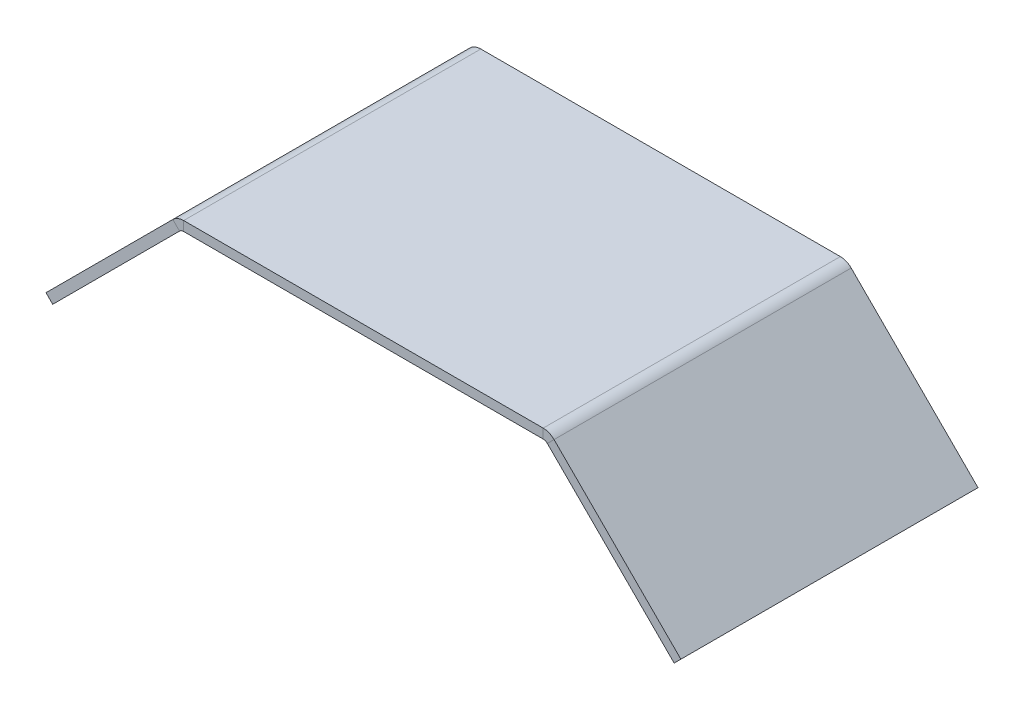
ISO-10303-21;
HEADER;
FILE_DESCRIPTION(('STEP AP214'),'2;1');
FILE_NAME('part.step','',(''),(''),'','','');
FILE_SCHEMA(('AUTOMOTIVE_DESIGN { 1 0 10303 214 1 1 1 1 }'));
ENDSEC;
DATA;
#1=APPLICATION_CONTEXT('core data for automotive mechanical design processes');
#2=APPLICATION_PROTOCOL_DEFINITION('international standard','automotive_design',2000,#1);
#3=PRODUCT_CONTEXT('',#1,'mechanical');
#4=PRODUCT('Part','Part','',(#3));
#5=PRODUCT_RELATED_PRODUCT_CATEGORY('part','',(#4));
#6=PRODUCT_DEFINITION_FORMATION('','',#4);
#7=PRODUCT_DEFINITION_CONTEXT('part definition',#1,'design');
#8=PRODUCT_DEFINITION('design','',#6,#7);
#9=PRODUCT_DEFINITION_SHAPE('','',#8);
#10=(LENGTH_UNIT() NAMED_UNIT(*) SI_UNIT(.MILLI.,.METRE.));
#11=(NAMED_UNIT(*) PLANE_ANGLE_UNIT() SI_UNIT($,.RADIAN.));
#12=(NAMED_UNIT(*) SI_UNIT($,.STERADIAN.) SOLID_ANGLE_UNIT());
#13=UNCERTAINTY_MEASURE_WITH_UNIT(LENGTH_MEASURE(1.E-05),#10,'distance_accuracy_value','');
#14=(GEOMETRIC_REPRESENTATION_CONTEXT(3) GLOBAL_UNCERTAINTY_ASSIGNED_CONTEXT((#13)) GLOBAL_UNIT_ASSIGNED_CONTEXT((#10,
#11,#12)) REPRESENTATION_CONTEXT('',''));
#15=CARTESIAN_POINT('',(0.,0.,0.));
#16=DIRECTION('',(0.,0.,1.));
#17=DIRECTION('',(1.,0.,0.));
#18=AXIS2_PLACEMENT_3D('',#15,#16,#17);
#19=CARTESIAN_POINT('',(-30.734,-1.6256,25.4));
#20=DIRECTION('',(0.,0.,1.));
#21=DIRECTION('',(1.,0.,0.));
#22=AXIS2_PLACEMENT_3D('',#19,#20,#21);
#23=PLANE('',#22);
#24=DIRECTION('',(1.,0.,0.));
#25=VECTOR('',#24,1.);
#26=CARTESIAN_POINT('',(-30.734,0.,25.4));
#27=LINE('',#26,#25);
#28=CARTESIAN_POINT('',(-30.734,0.,25.4));
#29=VERTEX_POINT('',#28);
#30=CARTESIAN_POINT('',(30.734,0.,25.4));
#31=VERTEX_POINT('',#30);
#32=EDGE_CURVE('E267',#29,#31,#27,.T.);
#33=ORIENTED_EDGE('',*,*,#32,.F.);
#34=DIRECTION('',(0.,1.,0.));
#35=VECTOR('',#34,1.);
#36=CARTESIAN_POINT('',(-30.734,-1.6256,25.4));
#37=LINE('',#36,#35);
#38=CARTESIAN_POINT('',(-30.734,-1.6256,25.4));
#39=VERTEX_POINT('',#38);
#40=EDGE_CURVE('E90',#39,#29,#37,.T.);
#41=ORIENTED_EDGE('',*,*,#40,.F.);
#42=DIRECTION('',(1.,0.,0.));
#43=VECTOR('',#42,1.);
#44=CARTESIAN_POINT('',(-30.734,-1.6256,25.4));
#45=LINE('',#44,#43);
#46=CARTESIAN_POINT('',(30.734,-1.6256,25.4));
#47=VERTEX_POINT('',#46);
#48=EDGE_CURVE('E272',#39,#47,#45,.T.);
#49=ORIENTED_EDGE('',*,*,#48,.T.);
#50=DIRECTION('',(0.,1.,0.));
#51=VECTOR('',#50,1.);
#52=CARTESIAN_POINT('',(30.734,-1.6256,25.4));
#53=LINE('',#52,#51);
#54=EDGE_CURVE('E13',#47,#31,#53,.T.);
#55=ORIENTED_EDGE('',*,*,#54,.T.);
#56=EDGE_LOOP('',(#33,#41,#49,#55));
#57=FACE_BOUND('',#56,.T.);
#58=ADVANCED_FACE('F81',(#57),#23,.T.);
#59=CARTESIAN_POINT('',(-30.734,-1.6256,-25.4));
#60=DIRECTION('',(0.,0.,-1.));
#61=DIRECTION('',(-1.,0.,0.));
#62=AXIS2_PLACEMENT_3D('',#59,#60,#61);
#63=PLANE('',#62);
#64=DIRECTION('',(-1.,0.,0.));
#65=VECTOR('',#64,1.);
#66=CARTESIAN_POINT('',(-30.734,0.,-25.4));
#67=LINE('',#66,#65);
#68=CARTESIAN_POINT('',(30.734,0.,-25.4));
#69=VERTEX_POINT('',#68);
#70=CARTESIAN_POINT('',(-30.734,0.,-25.4));
#71=VERTEX_POINT('',#70);
#72=EDGE_CURVE('E276',#69,#71,#67,.T.);
#73=ORIENTED_EDGE('',*,*,#72,.F.);
#74=DIRECTION('',(0.,1.,0.));
#75=VECTOR('',#74,1.);
#76=CARTESIAN_POINT('',(30.734,-1.6256,-25.4));
#77=LINE('',#76,#75);
#78=CARTESIAN_POINT('',(30.734,-1.6256,-25.4));
#79=VERTEX_POINT('',#78);
#80=EDGE_CURVE('E85',#79,#69,#77,.T.);
#81=ORIENTED_EDGE('',*,*,#80,.F.);
#82=DIRECTION('',(-1.,0.,0.));
#83=VECTOR('',#82,1.);
#84=CARTESIAN_POINT('',(-30.734,-1.6256,-25.4));
#85=LINE('',#84,#83);
#86=CARTESIAN_POINT('',(-30.734,-1.6256,-25.4));
#87=VERTEX_POINT('',#86);
#88=EDGE_CURVE('E266',#79,#87,#85,.T.);
#89=ORIENTED_EDGE('',*,*,#88,.T.);
#90=DIRECTION('',(0.,1.,0.));
#91=VECTOR('',#90,1.);
#92=CARTESIAN_POINT('',(-30.734,-1.6256,-25.4));
#93=LINE('',#92,#91);
#94=EDGE_CURVE('E284',#87,#71,#93,.T.);
#95=ORIENTED_EDGE('',*,*,#94,.T.);
#96=EDGE_LOOP('',(#73,#81,#89,#95));
#97=FACE_BOUND('',#96,.T.);
#98=ADVANCED_FACE('F83',(#97),#63,.T.);
#99=CARTESIAN_POINT('',(0.,-1.6256,0.));
#100=DIRECTION('',(0.,-1.,0.));
#101=DIRECTION('',(0.,0.,-1.));
#102=AXIS2_PLACEMENT_3D('',#99,#100,#101);
#103=PLANE('',#102);
#104=DIRECTION('',(0.,0.,-1.));
#105=VECTOR('',#104,1.);
#106=CARTESIAN_POINT('',(30.734,-1.6256,25.4));
#107=LINE('',#106,#105);
#108=EDGE_CURVE('E264',#47,#79,#107,.T.);
#109=ORIENTED_EDGE('',*,*,#108,.F.);
#110=ORIENTED_EDGE('',*,*,#48,.F.);
#111=DIRECTION('',(0.,0.,1.));
#112=VECTOR('',#111,1.);
#113=CARTESIAN_POINT('',(-30.734,-1.6256,25.4));
#114=LINE('',#113,#112);
#115=EDGE_CURVE('E270',#87,#39,#114,.T.);
#116=ORIENTED_EDGE('',*,*,#115,.F.);
#117=ORIENTED_EDGE('',*,*,#88,.F.);
#118=EDGE_LOOP('',(#109,#110,#116,#117));
#119=FACE_BOUND('',#118,.T.);
#120=ADVANCED_FACE('F304',(#119),#103,.T.);
#121=CARTESIAN_POINT('',(0.,0.,0.));
#122=DIRECTION('',(0.,-1.,0.));
#123=DIRECTION('',(0.,0.,-1.));
#124=AXIS2_PLACEMENT_3D('',#121,#122,#123);
#125=PLANE('',#124);
#126=DIRECTION('',(0.,0.,-1.));
#127=VECTOR('',#126,1.);
#128=CARTESIAN_POINT('',(30.734,0.,25.4));
#129=LINE('',#128,#127);
#130=EDGE_CURVE('E176',#31,#69,#129,.T.);
#131=ORIENTED_EDGE('',*,*,#130,.T.);
#132=ORIENTED_EDGE('',*,*,#72,.T.);
#133=DIRECTION('',(0.,0.,1.));
#134=VECTOR('',#133,1.);
#135=CARTESIAN_POINT('',(-30.734,0.,25.4));
#136=LINE('',#135,#134);
#137=EDGE_CURVE('E279',#71,#29,#136,.T.);
#138=ORIENTED_EDGE('',*,*,#137,.T.);
#139=ORIENTED_EDGE('',*,*,#32,.T.);
#140=EDGE_LOOP('',(#131,#132,#138,#139));
#141=FACE_BOUND('',#140,.T.);
#142=ADVANCED_FACE('F294',(#141),#125,.F.);
#143=CARTESIAN_POINT('',(-30.734,-2.6256,25.4));
#144=DIRECTION('',(0.,0.,1.));
#145=DIRECTION('',(1.,0.,0.));
#146=AXIS2_PLACEMENT_3D('',#143,#144,#145);
#147=PLANE('',#146);
#148=DIRECTION('',(0.707106781186544,-0.707106781186551,0.));
#149=VECTOR('',#148,1.);
#150=CARTESIAN_POINT('',(-32.5905795646834,-0.769020435316594,25.4));
#151=LINE('',#150,#149);
#152=CARTESIAN_POINT('',(-31.4411067811865,-1.91849321881345,25.4));
#153=VERTEX_POINT('',#152);
#154=CARTESIAN_POINT('',(-32.5905795646834,-0.769020435316591,25.4));
#155=VERTEX_POINT('',#154);
#156=EDGE_CURVE('E219',#153,#155,#151,.F.);
#157=ORIENTED_EDGE('',*,*,#156,.F.);
#158=CARTESIAN_POINT('',(-30.734,-2.6256,25.4));
#159=DIRECTION('',(0.,0.,-1.));
#160=DIRECTION('',(-1.,0.,0.));
#161=AXIS2_PLACEMENT_3D('',#158,#159,#160);
#162=CIRCLE('',#161,1.);
#163=EDGE_CURVE('E259',#39,#153,#162,.F.);
#164=ORIENTED_EDGE('',*,*,#163,.F.);
#165=ORIENTED_EDGE('',*,*,#40,.T.);
#166=CARTESIAN_POINT('',(-30.734,-2.6256,25.4));
#167=DIRECTION('',(0.,0.,-1.));
#168=DIRECTION('',(-1.,0.,0.));
#169=AXIS2_PLACEMENT_3D('',#166,#167,#168);
#170=CIRCLE('',#169,2.6256);
#171=EDGE_CURVE('E98',#29,#155,#170,.F.);
#172=ORIENTED_EDGE('',*,*,#171,.T.);
#173=EDGE_LOOP('',(#157,#164,#165,#172));
#174=FACE_BOUND('',#173,.T.);
#175=ADVANCED_FACE('F312',(#174),#147,.T.);
#176=CARTESIAN_POINT('',(-30.734,-2.6256,-25.4));
#177=DIRECTION('',(0.,0.,1.));
#178=DIRECTION('',(1.,0.,0.));
#179=AXIS2_PLACEMENT_3D('',#176,#177,#178);
#180=PLANE('',#179);
#181=CARTESIAN_POINT('',(-30.734,-2.6256,-25.4));
#182=DIRECTION('',(0.,0.,-1.));
#183=DIRECTION('',(-1.,0.,0.));
#184=AXIS2_PLACEMENT_3D('',#181,#182,#183);
#185=CIRCLE('',#184,1.);
#186=CARTESIAN_POINT('',(-31.4411067811865,-1.91849321881345,-25.4));
#187=VERTEX_POINT('',#186);
#188=EDGE_CURVE('E227',#187,#87,#185,.T.);
#189=ORIENTED_EDGE('',*,*,#188,.F.);
#190=DIRECTION('',(0.707106781186544,-0.707106781186551,0.));
#191=VECTOR('',#190,1.);
#192=CARTESIAN_POINT('',(-31.4411067811865,-1.91849321881345,-25.4));
#193=LINE('',#192,#191);
#194=CARTESIAN_POINT('',(-32.5905795646834,-0.769020435316593,-25.4));
#195=VERTEX_POINT('',#194);
#196=EDGE_CURVE('E248',#187,#195,#193,.F.);
#197=ORIENTED_EDGE('',*,*,#196,.T.);
#198=CARTESIAN_POINT('',(-30.734,-2.6256,-25.4));
#199=DIRECTION('',(0.,0.,-1.));
#200=DIRECTION('',(-1.,0.,0.));
#201=AXIS2_PLACEMENT_3D('',#198,#199,#200);
#202=CIRCLE('',#201,2.6256);
#203=EDGE_CURVE('E256',#195,#71,#202,.T.);
#204=ORIENTED_EDGE('',*,*,#203,.T.);
#205=ORIENTED_EDGE('',*,*,#94,.F.);
#206=EDGE_LOOP('',(#189,#197,#204,#205));
#207=FACE_BOUND('',#206,.T.);
#208=ADVANCED_FACE('F331',(#207),#180,.F.);
#209=CARTESIAN_POINT('',(-30.734,-2.6256,-25.4));
#210=DIRECTION('',(0.,0.,-1.));
#211=DIRECTION('',(-0.707106781186544,0.707106781186551,0.));
#212=AXIS2_PLACEMENT_3D('',#209,#210,#211);
#213=CYLINDRICAL_SURFACE('',#212,2.6256);
#214=ORIENTED_EDGE('',*,*,#137,.F.);
#215=ORIENTED_EDGE('',*,*,#203,.F.);
#216=DIRECTION('',(0.,0.,-1.));
#217=VECTOR('',#216,1.);
#218=CARTESIAN_POINT('',(-32.5905795646834,-0.769020435316594,0.));
#219=LINE('',#218,#217);
#220=EDGE_CURVE('E245',#155,#195,#219,.T.);
#221=ORIENTED_EDGE('',*,*,#220,.F.);
#222=ORIENTED_EDGE('',*,*,#171,.F.);
#223=EDGE_LOOP('',(#214,#215,#221,#222));
#224=FACE_BOUND('',#223,.T.);
#225=ADVANCED_FACE('F332',(#224),#213,.T.);
#226=CARTESIAN_POINT('',(-30.734,-2.6256,-25.4));
#227=DIRECTION('',(0.,0.,-1.));
#228=DIRECTION('',(-0.707106781186544,0.707106781186551,0.));
#229=AXIS2_PLACEMENT_3D('',#226,#227,#228);
#230=CYLINDRICAL_SURFACE('',#229,1.);
#231=ORIENTED_EDGE('',*,*,#115,.T.);
#232=ORIENTED_EDGE('',*,*,#163,.T.);
#233=DIRECTION('',(0.,0.,1.));
#234=VECTOR('',#233,1.);
#235=CARTESIAN_POINT('',(-31.4411067811865,-1.91849321881345,25.4));
#236=LINE('',#235,#234);
#237=EDGE_CURVE('E251',#153,#187,#236,.F.);
#238=ORIENTED_EDGE('',*,*,#237,.T.);
#239=ORIENTED_EDGE('',*,*,#188,.T.);
#240=EDGE_LOOP('',(#231,#232,#238,#239));
#241=FACE_BOUND('',#240,.T.);
#242=ADVANCED_FACE('F308',(#241),#230,.F.);
#243=CARTESIAN_POINT('',(-32.2976863458699,-0.476127216503144,-25.4));
#244=DIRECTION('',(0.,0.,1.));
#245=DIRECTION('',(1.,0.,0.));
#246=AXIS2_PLACEMENT_3D('',#243,#244,#245);
#247=PLANE('',#246);
#248=ORIENTED_EDGE('',*,*,#196,.F.);
#249=DIRECTION('',(-0.707106781186551,-0.707106781186544,0.));
#250=VECTOR('',#249,1.);
#251=CARTESIAN_POINT('',(-31.1482135623731,-1.6256,-25.4));
#252=LINE('',#251,#250);
#253=CARTESIAN_POINT('',(-53.1227266485429,-23.6001130861696,-25.4));
#254=VERTEX_POINT('',#253);
#255=EDGE_CURVE('E243',#187,#254,#252,.T.);
#256=ORIENTED_EDGE('',*,*,#255,.T.);
#257=DIRECTION('',(0.707106781186544,-0.707106781186551,0.));
#258=VECTOR('',#257,1.);
#259=CARTESIAN_POINT('',(-54.2721994320398,-22.4506403026728,-25.4));
#260=LINE('',#259,#258);
#261=CARTESIAN_POINT('',(-54.2721994320398,-22.4506403026728,-25.4));
#262=VERTEX_POINT('',#261);
#263=EDGE_CURVE('E224',#262,#254,#260,.T.);
#264=ORIENTED_EDGE('',*,*,#263,.F.);
#265=DIRECTION('',(0.707106781186551,0.707106781186544,0.));
#266=VECTOR('',#265,1.);
#267=CARTESIAN_POINT('',(-16.1178863458698,15.7036727834968,-25.4));
#268=LINE('',#267,#266);
#269=EDGE_CURVE('E236',#195,#262,#268,.F.);
#270=ORIENTED_EDGE('',*,*,#269,.F.);
#271=EDGE_LOOP('',(#248,#256,#264,#270));
#272=FACE_BOUND('',#271,.T.);
#273=ADVANCED_FACE('F339',(#272),#247,.F.);
#274=CARTESIAN_POINT('',(-54.2721994320398,-22.4506403026728,25.4));
#275=DIRECTION('',(0.,0.,-1.));
#276=DIRECTION('',(-1.,0.,0.));
#277=AXIS2_PLACEMENT_3D('',#274,#275,#276);
#278=PLANE('',#277);
#279=ORIENTED_EDGE('',*,*,#156,.T.);
#280=DIRECTION('',(-0.707106781186551,-0.707106781186544,0.));
#281=VECTOR('',#280,1.);
#282=CARTESIAN_POINT('',(-16.1178863458698,15.7036727834968,25.4));
#283=LINE('',#282,#281);
#284=CARTESIAN_POINT('',(-54.2721994320398,-22.4506403026728,25.4));
#285=VERTEX_POINT('',#284);
#286=EDGE_CURVE('E231',#285,#155,#283,.F.);
#287=ORIENTED_EDGE('',*,*,#286,.F.);
#288=DIRECTION('',(0.707106781186544,-0.707106781186551,0.));
#289=VECTOR('',#288,1.);
#290=CARTESIAN_POINT('',(-54.2721994320398,-22.4506403026728,25.4));
#291=LINE('',#290,#289);
#292=CARTESIAN_POINT('',(-53.1227266485429,-23.6001130861696,25.4));
#293=VERTEX_POINT('',#292);
#294=EDGE_CURVE('E228',#285,#293,#291,.T.);
#295=ORIENTED_EDGE('',*,*,#294,.T.);
#296=DIRECTION('',(0.707106781186551,0.707106781186544,0.));
#297=VECTOR('',#296,1.);
#298=CARTESIAN_POINT('',(-53.1227266485429,-23.6001130861696,25.4));
#299=LINE('',#298,#297);
#300=EDGE_CURVE('E238',#293,#153,#299,.T.);
#301=ORIENTED_EDGE('',*,*,#300,.T.);
#302=EDGE_LOOP('',(#279,#287,#295,#301));
#303=FACE_BOUND('',#302,.T.);
#304=ADVANCED_FACE('F315',(#303),#278,.F.);
#305=CARTESIAN_POINT('',(-16.1178863458698,15.7036727834968,0.));
#306=DIRECTION('',(-0.707106781186544,0.707106781186551,0.));
#307=DIRECTION('',(-0.707106781186551,-0.707106781186544,0.));
#308=AXIS2_PLACEMENT_3D('',#305,#306,#307);
#309=PLANE('',#308);
#310=ORIENTED_EDGE('',*,*,#286,.T.);
#311=ORIENTED_EDGE('',*,*,#220,.T.);
#312=ORIENTED_EDGE('',*,*,#269,.T.);
#313=DIRECTION('',(0.,0.,-1.));
#314=VECTOR('',#313,1.);
#315=CARTESIAN_POINT('',(-54.2721994320398,-22.4506403026728,0.));
#316=LINE('',#315,#314);
#317=EDGE_CURVE('E234',#262,#285,#316,.F.);
#318=ORIENTED_EDGE('',*,*,#317,.T.);
#319=EDGE_LOOP('',(#310,#311,#312,#318));
#320=FACE_BOUND('',#319,.T.);
#321=ADVANCED_FACE('F318',(#320),#309,.T.);
#322=CARTESIAN_POINT('',(-14.9684135623729,14.5542,0.));
#323=DIRECTION('',(-0.707106781186544,0.707106781186551,0.));
#324=DIRECTION('',(-0.707106781186551,-0.707106781186544,0.));
#325=AXIS2_PLACEMENT_3D('',#322,#323,#324);
#326=PLANE('',#325);
#327=ORIENTED_EDGE('',*,*,#237,.F.);
#328=ORIENTED_EDGE('',*,*,#300,.F.);
#329=DIRECTION('',(0.,0.,1.));
#330=VECTOR('',#329,1.);
#331=CARTESIAN_POINT('',(-53.1227266485429,-23.6001130861696,-25.4));
#332=LINE('',#331,#330);
#333=EDGE_CURVE('E241',#254,#293,#332,.T.);
#334=ORIENTED_EDGE('',*,*,#333,.F.);
#335=ORIENTED_EDGE('',*,*,#255,.F.);
#336=EDGE_LOOP('',(#327,#328,#334,#335));
#337=FACE_BOUND('',#336,.T.);
#338=ADVANCED_FACE('F327',(#337),#326,.F.);
#339=CARTESIAN_POINT('',(-54.2721994320398,-22.4506403026728,-25.4));
#340=DIRECTION('',(0.707106781186551,0.707106781186544,0.));
#341=DIRECTION('',(-0.707106781186544,0.707106781186551,0.));
#342=AXIS2_PLACEMENT_3D('',#339,#340,#341);
#343=PLANE('',#342);
#344=ORIENTED_EDGE('',*,*,#333,.T.);
#345=ORIENTED_EDGE('',*,*,#294,.F.);
#346=ORIENTED_EDGE('',*,*,#317,.F.);
#347=ORIENTED_EDGE('',*,*,#263,.T.);
#348=EDGE_LOOP('',(#344,#345,#346,#347));
#349=FACE_BOUND('',#348,.T.);
#350=ADVANCED_FACE('F324',(#349),#343,.F.);
#351=CARTESIAN_POINT('',(30.734,-2.6256,-25.4));
#352=DIRECTION('',(0.,0.,-1.));
#353=DIRECTION('',(-1.,0.,0.));
#354=AXIS2_PLACEMENT_3D('',#351,#352,#353);
#355=PLANE('',#354);
#356=DIRECTION('',(-0.707106781186544,-0.707106781186551,0.));
#357=VECTOR('',#356,1.);
#358=CARTESIAN_POINT('',(32.5905795646834,-0.769020435316594,-25.4));
#359=LINE('',#358,#357);
#360=CARTESIAN_POINT('',(31.4411067811865,-1.91849321881345,-25.4));
#361=VERTEX_POINT('',#360);
#362=CARTESIAN_POINT('',(32.5905795646834,-0.769020435316591,-25.4));
#363=VERTEX_POINT('',#362);
#364=EDGE_CURVE('E216',#361,#363,#359,.F.);
#365=ORIENTED_EDGE('',*,*,#364,.F.);
#366=CARTESIAN_POINT('',(30.734,-2.6256,-25.4));
#367=DIRECTION('',(0.,0.,1.));
#368=DIRECTION('',(1.,0.,0.));
#369=AXIS2_PLACEMENT_3D('',#366,#367,#368);
#370=CIRCLE('',#369,1.);
#371=EDGE_CURVE('E178',#79,#361,#370,.F.);
#372=ORIENTED_EDGE('',*,*,#371,.F.);
#373=ORIENTED_EDGE('',*,*,#80,.T.);
#374=CARTESIAN_POINT('',(30.734,-2.6256,-25.4));
#375=DIRECTION('',(0.,0.,1.));
#376=DIRECTION('',(1.,0.,0.));
#377=AXIS2_PLACEMENT_3D('',#374,#375,#376);
#378=CIRCLE('',#377,2.6256);
#379=EDGE_CURVE('E106',#69,#363,#378,.F.);
#380=ORIENTED_EDGE('',*,*,#379,.T.);
#381=EDGE_LOOP('',(#365,#372,#373,#380));
#382=FACE_BOUND('',#381,.T.);
#383=ADVANCED_FACE('F291',(#382),#355,.T.);
#384=CARTESIAN_POINT('',(30.734,-2.6256,25.4));
#385=DIRECTION('',(0.,0.,-1.));
#386=DIRECTION('',(-1.,0.,0.));
#387=AXIS2_PLACEMENT_3D('',#384,#385,#386);
#388=PLANE('',#387);
#389=CARTESIAN_POINT('',(30.734,-2.6256,25.4));
#390=DIRECTION('',(0.,0.,1.));
#391=DIRECTION('',(1.,0.,0.));
#392=AXIS2_PLACEMENT_3D('',#389,#390,#391);
#393=CIRCLE('',#392,1.);
#394=CARTESIAN_POINT('',(31.4411067811865,-1.91849321881345,25.4));
#395=VERTEX_POINT('',#394);
#396=EDGE_CURVE('E185',#395,#47,#393,.T.);
#397=ORIENTED_EDGE('',*,*,#396,.F.);
#398=DIRECTION('',(-0.707106781186544,-0.707106781186551,0.));
#399=VECTOR('',#398,1.);
#400=CARTESIAN_POINT('',(31.4411067811865,-1.91849321881345,25.4));
#401=LINE('',#400,#399);
#402=CARTESIAN_POINT('',(32.5905795646834,-0.769020435316593,25.4));
#403=VERTEX_POINT('',#402);
#404=EDGE_CURVE('E182',#395,#403,#401,.F.);
#405=ORIENTED_EDGE('',*,*,#404,.T.);
#406=CARTESIAN_POINT('',(30.734,-2.6256,25.4));
#407=DIRECTION('',(0.,0.,1.));
#408=DIRECTION('',(1.,0.,0.));
#409=AXIS2_PLACEMENT_3D('',#406,#407,#408);
#410=CIRCLE('',#409,2.6256);
#411=EDGE_CURVE('E170',#403,#31,#410,.T.);
#412=ORIENTED_EDGE('',*,*,#411,.T.);
#413=ORIENTED_EDGE('',*,*,#54,.F.);
#414=EDGE_LOOP('',(#397,#405,#412,#413));
#415=FACE_BOUND('',#414,.T.);
#416=ADVANCED_FACE('F183',(#415),#388,.F.);
#417=CARTESIAN_POINT('',(30.734,-2.6256,25.4));
#418=DIRECTION('',(0.,0.,1.));
#419=DIRECTION('',(0.707106781186544,0.707106781186551,0.));
#420=AXIS2_PLACEMENT_3D('',#417,#418,#419);
#421=CYLINDRICAL_SURFACE('',#420,2.6256);
#422=ORIENTED_EDGE('',*,*,#130,.F.);
#423=ORIENTED_EDGE('',*,*,#411,.F.);
#424=DIRECTION('',(0.,0.,1.));
#425=VECTOR('',#424,1.);
#426=CARTESIAN_POINT('',(32.5905795646834,-0.769020435316594,0.));
#427=LINE('',#426,#425);
#428=EDGE_CURVE('E174',#363,#403,#427,.T.);
#429=ORIENTED_EDGE('',*,*,#428,.F.);
#430=ORIENTED_EDGE('',*,*,#379,.F.);
#431=EDGE_LOOP('',(#422,#423,#429,#430));
#432=FACE_BOUND('',#431,.T.);
#433=ADVANCED_FACE('F172',(#432),#421,.T.);
#434=CARTESIAN_POINT('',(30.734,-2.6256,25.4));
#435=DIRECTION('',(0.,0.,1.));
#436=DIRECTION('',(0.707106781186544,0.707106781186551,0.));
#437=AXIS2_PLACEMENT_3D('',#434,#435,#436);
#438=CYLINDRICAL_SURFACE('',#437,1.);
#439=ORIENTED_EDGE('',*,*,#108,.T.);
#440=ORIENTED_EDGE('',*,*,#371,.T.);
#441=DIRECTION('',(0.,0.,-1.));
#442=VECTOR('',#441,1.);
#443=CARTESIAN_POINT('',(31.4411067811865,-1.91849321881345,-25.4));
#444=LINE('',#443,#442);
#445=EDGE_CURVE('E189',#361,#395,#444,.F.);
#446=ORIENTED_EDGE('',*,*,#445,.T.);
#447=ORIENTED_EDGE('',*,*,#396,.T.);
#448=EDGE_LOOP('',(#439,#440,#446,#447));
#449=FACE_BOUND('',#448,.T.);
#450=ADVANCED_FACE('F301',(#449),#438,.F.);
#451=CARTESIAN_POINT('',(32.2976863458699,-0.476127216503144,25.4));
#452=DIRECTION('',(0.,0.,-1.));
#453=DIRECTION('',(-1.,0.,0.));
#454=AXIS2_PLACEMENT_3D('',#451,#452,#453);
#455=PLANE('',#454);
#456=ORIENTED_EDGE('',*,*,#404,.F.);
#457=DIRECTION('',(0.707106781186551,-0.707106781186544,0.));
#458=VECTOR('',#457,1.);
#459=CARTESIAN_POINT('',(31.1482135623731,-1.6256,25.4));
#460=LINE('',#459,#458);
#461=CARTESIAN_POINT('',(53.1227266485429,-23.6001130861696,25.4));
#462=VERTEX_POINT('',#461);
#463=EDGE_CURVE('E198',#395,#462,#460,.T.);
#464=ORIENTED_EDGE('',*,*,#463,.T.);
#465=DIRECTION('',(-0.707106781186544,-0.707106781186551,0.));
#466=VECTOR('',#465,1.);
#467=CARTESIAN_POINT('',(54.2721994320398,-22.4506403026728,25.4));
#468=LINE('',#467,#466);
#469=CARTESIAN_POINT('',(54.2721994320398,-22.4506403026728,25.4));
#470=VERTEX_POINT('',#469);
#471=EDGE_CURVE('E202',#470,#462,#468,.T.);
#472=ORIENTED_EDGE('',*,*,#471,.F.);
#473=DIRECTION('',(-0.707106781186551,0.707106781186544,0.));
#474=VECTOR('',#473,1.);
#475=CARTESIAN_POINT('',(16.1178863458698,15.7036727834968,25.4));
#476=LINE('',#475,#474);
#477=EDGE_CURVE('E194',#403,#470,#476,.F.);
#478=ORIENTED_EDGE('',*,*,#477,.F.);
#479=EDGE_LOOP('',(#456,#464,#472,#478));
#480=FACE_BOUND('',#479,.T.);
#481=ADVANCED_FACE('F200',(#480),#455,.F.);
#482=CARTESIAN_POINT('',(54.2721994320398,-22.4506403026728,-25.4));
#483=DIRECTION('',(0.,0.,1.));
#484=DIRECTION('',(1.,0.,0.));
#485=AXIS2_PLACEMENT_3D('',#482,#483,#484);
#486=PLANE('',#485);
#487=ORIENTED_EDGE('',*,*,#364,.T.);
#488=DIRECTION('',(0.707106781186551,-0.707106781186544,0.));
#489=VECTOR('',#488,1.);
#490=CARTESIAN_POINT('',(16.1178863458698,15.7036727834968,-25.4));
#491=LINE('',#490,#489);
#492=CARTESIAN_POINT('',(54.2721994320398,-22.4506403026728,-25.4));
#493=VERTEX_POINT('',#492);
#494=EDGE_CURVE('E197',#493,#363,#491,.F.);
#495=ORIENTED_EDGE('',*,*,#494,.F.);
#496=DIRECTION('',(-0.707106781186544,-0.707106781186551,0.));
#497=VECTOR('',#496,1.);
#498=CARTESIAN_POINT('',(54.2721994320398,-22.4506403026728,-25.4));
#499=LINE('',#498,#497);
#500=CARTESIAN_POINT('',(53.1227266485429,-23.6001130861696,-25.4));
#501=VERTEX_POINT('',#500);
#502=EDGE_CURVE('E606',#493,#501,#499,.T.);
#503=ORIENTED_EDGE('',*,*,#502,.T.);
#504=DIRECTION('',(-0.707106781186551,0.707106781186544,0.));
#505=VECTOR('',#504,1.);
#506=CARTESIAN_POINT('',(53.1227266485429,-23.6001130861696,-25.4));
#507=LINE('',#506,#505);
#508=EDGE_CURVE('E205',#501,#361,#507,.T.);
#509=ORIENTED_EDGE('',*,*,#508,.T.);
#510=EDGE_LOOP('',(#487,#495,#503,#509));
#511=FACE_BOUND('',#510,.T.);
#512=ADVANCED_FACE('F464',(#511),#486,.F.);
#513=CARTESIAN_POINT('',(16.1178863458698,15.7036727834968,0.));
#514=DIRECTION('',(0.707106781186544,0.707106781186551,0.));
#515=DIRECTION('',(-0.707106781186551,0.707106781186544,0.));
#516=AXIS2_PLACEMENT_3D('',#513,#514,#515);
#517=PLANE('',#516);
#518=ORIENTED_EDGE('',*,*,#494,.T.);
#519=ORIENTED_EDGE('',*,*,#428,.T.);
#520=ORIENTED_EDGE('',*,*,#477,.T.);
#521=DIRECTION('',(0.,0.,1.));
#522=VECTOR('',#521,1.);
#523=CARTESIAN_POINT('',(54.2721994320398,-22.4506403026728,0.));
#524=LINE('',#523,#522);
#525=EDGE_CURVE('E204',#470,#493,#524,.F.);
#526=ORIENTED_EDGE('',*,*,#525,.T.);
#527=EDGE_LOOP('',(#518,#519,#520,#526));
#528=FACE_BOUND('',#527,.T.);
#529=ADVANCED_FACE('F193',(#528),#517,.T.);
#530=CARTESIAN_POINT('',(14.9684135623729,14.5542,0.));
#531=DIRECTION('',(0.707106781186544,0.707106781186551,0.));
#532=DIRECTION('',(-0.707106781186551,0.707106781186544,0.));
#533=AXIS2_PLACEMENT_3D('',#530,#531,#532);
#534=PLANE('',#533);
#535=ORIENTED_EDGE('',*,*,#445,.F.);
#536=ORIENTED_EDGE('',*,*,#508,.F.);
#537=DIRECTION('',(0.,0.,-1.));
#538=VECTOR('',#537,1.);
#539=CARTESIAN_POINT('',(53.1227266485429,-23.6001130861696,25.4));
#540=LINE('',#539,#538);
#541=EDGE_CURVE('E209',#462,#501,#540,.T.);
#542=ORIENTED_EDGE('',*,*,#541,.F.);
#543=ORIENTED_EDGE('',*,*,#463,.F.);
#544=EDGE_LOOP('',(#535,#536,#542,#543));
#545=FACE_BOUND('',#544,.T.);
#546=ADVANCED_FACE('F484',(#545),#534,.F.);
#547=CARTESIAN_POINT('',(54.2721994320398,-22.4506403026728,25.4));
#548=DIRECTION('',(-0.707106781186551,0.707106781186544,0.));
#549=DIRECTION('',(-0.707106781186544,-0.707106781186551,0.));
#550=AXIS2_PLACEMENT_3D('',#547,#548,#549);
#551=PLANE('',#550);
#552=ORIENTED_EDGE('',*,*,#541,.T.);
#553=ORIENTED_EDGE('',*,*,#502,.F.);
#554=ORIENTED_EDGE('',*,*,#525,.F.);
#555=ORIENTED_EDGE('',*,*,#471,.T.);
#556=EDGE_LOOP('',(#552,#553,#554,#555));
#557=FACE_BOUND('',#556,.T.);
#558=ADVANCED_FACE('F494',(#557),#551,.F.);
#559=CLOSED_SHELL('',(#58,#98,#120,#142,#175,#208,#225,#242,#273,#304,#321,#338,#350,#383,#416,
#433,#450,#481,#512,#529,#546,#558));
#560=MANIFOLD_SOLID_BREP('B2',#559);
#561=ADVANCED_BREP_SHAPE_REPRESENTATION('',(#18,#560),#14);
#562=SHAPE_DEFINITION_REPRESENTATION(#9,#561);
ENDSEC;
END-ISO-10303-21;
